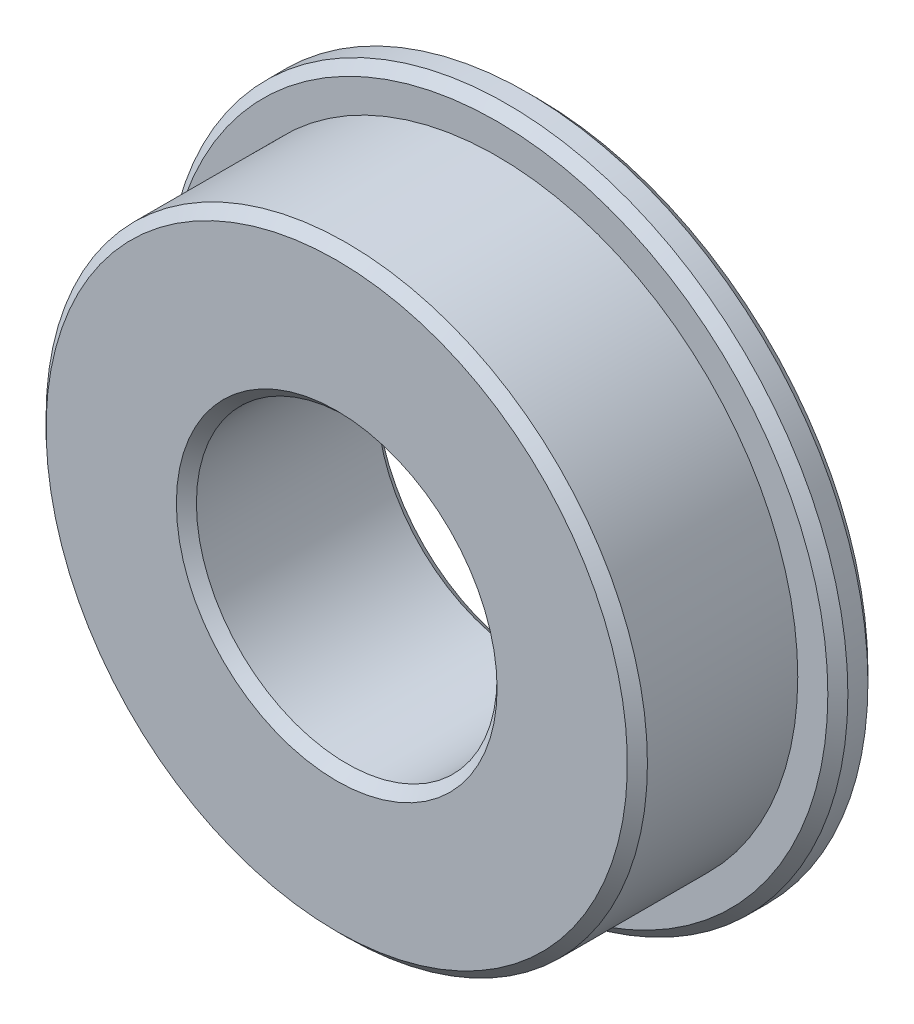
ISO-10303-21;
HEADER;
FILE_DESCRIPTION(('STEP AP214'),'2;1');
FILE_NAME('part.step','',(''),(''),'','','');
FILE_SCHEMA(('AUTOMOTIVE_DESIGN { 1 0 10303 214 1 1 1 1 }'));
ENDSEC;
DATA;
#1=APPLICATION_CONTEXT('core data for automotive mechanical design processes');
#2=APPLICATION_PROTOCOL_DEFINITION('international standard','automotive_design',2000,#1);
#3=PRODUCT_CONTEXT('',#1,'mechanical');
#4=PRODUCT('Part','Part','',(#3));
#5=PRODUCT_RELATED_PRODUCT_CATEGORY('part','',(#4));
#6=PRODUCT_DEFINITION_FORMATION('','',#4);
#7=PRODUCT_DEFINITION_CONTEXT('part definition',#1,'design');
#8=PRODUCT_DEFINITION('design','',#6,#7);
#9=PRODUCT_DEFINITION_SHAPE('','',#8);
#10=(LENGTH_UNIT() NAMED_UNIT(*) SI_UNIT(.MILLI.,.METRE.));
#11=(NAMED_UNIT(*) PLANE_ANGLE_UNIT() SI_UNIT($,.RADIAN.));
#12=(NAMED_UNIT(*) SI_UNIT($,.STERADIAN.) SOLID_ANGLE_UNIT());
#13=UNCERTAINTY_MEASURE_WITH_UNIT(LENGTH_MEASURE(1.E-05),#10,'distance_accuracy_value','');
#14=(GEOMETRIC_REPRESENTATION_CONTEXT(3) GLOBAL_UNCERTAINTY_ASSIGNED_CONTEXT((#13)) GLOBAL_UNIT_ASSIGNED_CONTEXT((#10,
#11,#12)) REPRESENTATION_CONTEXT('',''));
#15=CARTESIAN_POINT('',(0.,0.,0.));
#16=DIRECTION('',(0.,0.,1.));
#17=DIRECTION('',(1.,0.,0.));
#18=AXIS2_PLACEMENT_3D('',#15,#16,#17);
#19=CARTESIAN_POINT('',(0.,0.,-5.6843418860808E-11));
#20=DIRECTION('',(0.,0.,-1.));
#21=DIRECTION('',(-1.,0.,0.));
#22=AXIS2_PLACEMENT_3D('',#19,#20,#21);
#23=CONICAL_SURFACE('',#22,3.20000000004939,0.785398163397448);
#24=CARTESIAN_POINT('',(0.,0.,-5.6843418860808E-11));
#25=DIRECTION('',(0.,0.,-1.));
#26=DIRECTION('',(-1.,0.,0.));
#27=AXIS2_PLACEMENT_3D('',#24,#25,#26);
#28=CIRCLE('',#27,3.20000000004939);
#29=CARTESIAN_POINT('',(-3.20000000004939,0.,-5.6843418860808E-11));
#30=VERTEX_POINT('',#29);
#31=EDGE_CURVE('E18',#30,#30,#28,.T.);
#32=ORIENTED_EDGE('',*,*,#31,.T.);
#33=EDGE_LOOP('',(#32));
#34=FACE_BOUND('',#33,.T.);
#35=CARTESIAN_POINT('',(0.,0.,0.2));
#36=DIRECTION('',(0.,0.,1.));
#37=DIRECTION('',(1.,0.,0.));
#38=AXIS2_PLACEMENT_3D('',#35,#36,#37);
#39=CIRCLE('',#38,3.);
#40=CARTESIAN_POINT('',(3.,0.,0.2));
#41=VERTEX_POINT('',#40);
#42=EDGE_CURVE('E44',#41,#41,#39,.T.);
#43=ORIENTED_EDGE('',*,*,#42,.T.);
#44=EDGE_LOOP('',(#43));
#45=FACE_BOUND('',#44,.T.);
#46=ADVANCED_FACE('F15',(#34,#45),#23,.F.);
#47=CARTESIAN_POINT('',(0.,0.,0.));
#48=DIRECTION('',(0.,0.,1.));
#49=DIRECTION('',(1.,0.,0.));
#50=AXIS2_PLACEMENT_3D('',#47,#48,#49);
#51=PLANE('',#50);
#52=ORIENTED_EDGE('',*,*,#31,.F.);
#53=EDGE_LOOP('',(#52));
#54=FACE_BOUND('',#53,.T.);
#55=CARTESIAN_POINT('',(0.,0.,-1.1368686482667E-10));
#56=DIRECTION('',(0.,0.,1.));
#57=DIRECTION('',(0.,-1.,0.));
#58=AXIS2_PLACEMENT_3D('',#55,#56,#57);
#59=CIRCLE('',#58,6.59999999999172);
#60=CARTESIAN_POINT('',(0.,-6.59999999999172,-1.13686851672747E-10));
#61=VERTEX_POINT('',#60);
#62=EDGE_CURVE('E42',#61,#61,#59,.T.);
#63=ORIENTED_EDGE('',*,*,#62,.F.);
#64=EDGE_LOOP('',(#63));
#65=FACE_BOUND('',#64,.T.);
#66=ADVANCED_FACE('F73',(#54,#65),#51,.F.);
#67=CARTESIAN_POINT('',(0.,0.,0.));
#68=DIRECTION('',(0.,0.,1.));
#69=DIRECTION('',(1.,0.,0.));
#70=AXIS2_PLACEMENT_3D('',#67,#68,#69);
#71=CYLINDRICAL_SURFACE('',#70,3.);
#72=ORIENTED_EDGE('',*,*,#42,.F.);
#73=EDGE_LOOP('',(#72));
#74=FACE_BOUND('',#73,.T.);
#75=CARTESIAN_POINT('',(0.,0.,3.79999999995562));
#76=DIRECTION('',(0.,0.,1.));
#77=DIRECTION('',(1.,0.,0.));
#78=AXIS2_PLACEMENT_3D('',#75,#76,#77);
#79=CIRCLE('',#78,2.9999999999859);
#80=CARTESIAN_POINT('',(2.9999999999859,0.,3.79999999995562));
#81=VERTEX_POINT('',#80);
#82=EDGE_CURVE('E31',#81,#81,#79,.T.);
#83=ORIENTED_EDGE('',*,*,#82,.T.);
#84=EDGE_LOOP('',(#83));
#85=FACE_BOUND('',#84,.T.);
#86=ADVANCED_FACE('F64',(#74,#85),#71,.F.);
#87=CARTESIAN_POINT('',(0.,0.,0.199999999949796));
#88=DIRECTION('',(0.,0.,1.));
#89=DIRECTION('',(0.,-1.,0.));
#90=AXIS2_PLACEMENT_3D('',#87,#88,#89);
#91=CONICAL_SURFACE('',#90,6.80000000005521,0.785398163397448);
#92=ORIENTED_EDGE('',*,*,#62,.T.);
#93=EDGE_LOOP('',(#92));
#94=FACE_BOUND('',#93,.T.);
#95=CARTESIAN_POINT('',(0.,0.,0.2));
#96=DIRECTION('',(0.,0.,1.));
#97=DIRECTION('',(1.,0.,0.));
#98=AXIS2_PLACEMENT_3D('',#95,#96,#97);
#99=CIRCLE('',#98,6.8);
#100=CARTESIAN_POINT('',(6.8,0.,0.2));
#101=VERTEX_POINT('',#100);
#102=EDGE_CURVE('E41',#101,#101,#99,.T.);
#103=ORIENTED_EDGE('',*,*,#102,.F.);
#104=EDGE_LOOP('',(#103));
#105=FACE_BOUND('',#104,.T.);
#106=ADVANCED_FACE('F61',(#94,#105),#91,.T.);
#107=CARTESIAN_POINT('',(0.,0.,4.0000000000191));
#108=DIRECTION('',(0.,0.,1.));
#109=DIRECTION('',(1.,0.,0.));
#110=AXIS2_PLACEMENT_3D('',#107,#108,#109);
#111=CONICAL_SURFACE('',#110,3.20000000004939,0.785398163397448);
#112=ORIENTED_EDGE('',*,*,#82,.F.);
#113=EDGE_LOOP('',(#112));
#114=FACE_BOUND('',#113,.T.);
#115=CARTESIAN_POINT('',(0.,0.,4.0000000000191));
#116=DIRECTION('',(0.,0.,1.));
#117=DIRECTION('',(1.,0.,0.));
#118=AXIS2_PLACEMENT_3D('',#115,#116,#117);
#119=CIRCLE('',#118,3.20000000004939);
#120=CARTESIAN_POINT('',(3.20000000004939,0.,4.0000000000191));
#121=VERTEX_POINT('',#120);
#122=EDGE_CURVE('E39',#121,#121,#119,.F.);
#123=ORIENTED_EDGE('',*,*,#122,.F.);
#124=EDGE_LOOP('',(#123));
#125=FACE_BOUND('',#124,.T.);
#126=ADVANCED_FACE('F63',(#114,#125),#111,.F.);
#127=CARTESIAN_POINT('',(0.,0.,0.));
#128=DIRECTION('',(0.,0.,1.));
#129=DIRECTION('',(1.,0.,0.));
#130=AXIS2_PLACEMENT_3D('',#127,#128,#129);
#131=CYLINDRICAL_SURFACE('',#130,6.8);
#132=ORIENTED_EDGE('',*,*,#102,.T.);
#133=EDGE_LOOP('',(#132));
#134=FACE_BOUND('',#133,.T.);
#135=CARTESIAN_POINT('',(0.,0.,0.600000000019918));
#136=DIRECTION('',(0.,0.,-1.));
#137=DIRECTION('',(1.,0.,0.));
#138=AXIS2_PLACEMENT_3D('',#135,#136,#137);
#139=CIRCLE('',#138,6.80000000005521);
#140=CARTESIAN_POINT('',(6.80000000005521,0.,0.600000000019918));
#141=VERTEX_POINT('',#140);
#142=EDGE_CURVE('E38',#141,#141,#139,.F.);
#143=ORIENTED_EDGE('',*,*,#142,.F.);
#144=EDGE_LOOP('',(#143));
#145=FACE_BOUND('',#144,.T.);
#146=ADVANCED_FACE('F58',(#134,#145),#131,.T.);
#147=CARTESIAN_POINT('',(0.,0.,4.));
#148=DIRECTION('',(0.,0.,1.));
#149=DIRECTION('',(1.,0.,0.));
#150=AXIS2_PLACEMENT_3D('',#147,#148,#149);
#151=PLANE('',#150);
#152=ORIENTED_EDGE('',*,*,#122,.T.);
#153=EDGE_LOOP('',(#152));
#154=FACE_BOUND('',#153,.T.);
#155=CARTESIAN_POINT('',(0.,0.,4.0000000000191));
#156=DIRECTION('',(0.,0.,-1.));
#157=DIRECTION('',(0.,1.,0.));
#158=AXIS2_PLACEMENT_3D('',#155,#156,#157);
#159=CIRCLE('',#158,5.80000000002201);
#160=CARTESIAN_POINT('',(0.,5.80000000002201,4.0000000000191));
#161=VERTEX_POINT('',#160);
#162=EDGE_CURVE('E35',#161,#161,#159,.T.);
#163=ORIENTED_EDGE('',*,*,#162,.F.);
#164=EDGE_LOOP('',(#163));
#165=FACE_BOUND('',#164,.T.);
#166=ADVANCED_FACE('F94',(#154,#165),#151,.T.);
#167=CARTESIAN_POINT('',(0.,0.,0.600000000019918));
#168=DIRECTION('',(0.,0.,-1.));
#169=DIRECTION('',(-1.,0.,0.));
#170=AXIS2_PLACEMENT_3D('',#167,#168,#169);
#171=CONICAL_SURFACE('',#170,6.80000000005521,0.785398163397448);
#172=ORIENTED_EDGE('',*,*,#142,.T.);
#173=EDGE_LOOP('',(#172));
#174=FACE_BOUND('',#173,.T.);
#175=CARTESIAN_POINT('',(0.,0.,0.799999999969714));
#176=DIRECTION('',(0.,0.,-1.));
#177=DIRECTION('',(-1.,0.,0.));
#178=AXIS2_PLACEMENT_3D('',#175,#176,#177);
#179=CIRCLE('',#178,6.60000000010541);
#180=CARTESIAN_POINT('',(-6.60000000010541,0.,0.799999999969714));
#181=VERTEX_POINT('',#180);
#182=EDGE_CURVE('E27',#181,#181,#179,.F.);
#183=ORIENTED_EDGE('',*,*,#182,.F.);
#184=EDGE_LOOP('',(#183));
#185=FACE_BOUND('',#184,.T.);
#186=ADVANCED_FACE('F90',(#174,#185),#171,.T.);
#187=CARTESIAN_POINT('',(0.,0.,3.79999999989877));
#188=DIRECTION('',(0.,0.,-1.));
#189=DIRECTION('',(0.,1.,0.));
#190=AXIS2_PLACEMENT_3D('',#187,#188,#189);
#191=CONICAL_SURFACE('',#190,6.00000000014234,0.785398163397448);
#192=CARTESIAN_POINT('',(0.,0.,3.8));
#193=DIRECTION('',(0.,0.,1.));
#194=DIRECTION('',(1.,0.,0.));
#195=AXIS2_PLACEMENT_3D('',#192,#193,#194);
#196=CIRCLE('',#195,6.);
#197=CARTESIAN_POINT('',(6.,0.,3.8));
#198=VERTEX_POINT('',#197);
#199=EDGE_CURVE('E22',#198,#198,#196,.F.);
#200=ORIENTED_EDGE('',*,*,#199,.F.);
#201=EDGE_LOOP('',(#200));
#202=FACE_BOUND('',#201,.T.);
#203=ORIENTED_EDGE('',*,*,#162,.T.);
#204=EDGE_LOOP('',(#203));
#205=FACE_BOUND('',#204,.T.);
#206=ADVANCED_FACE('F83',(#202,#205),#191,.T.);
#207=CARTESIAN_POINT('',(0.,0.,0.8));
#208=DIRECTION('',(0.,0.,1.));
#209=DIRECTION('',(1.,0.,0.));
#210=AXIS2_PLACEMENT_3D('',#207,#208,#209);
#211=PLANE('',#210);
#212=CARTESIAN_POINT('',(0.,0.,0.8));
#213=DIRECTION('',(0.,0.,1.));
#214=DIRECTION('',(1.,0.,0.));
#215=AXIS2_PLACEMENT_3D('',#212,#213,#214);
#216=CIRCLE('',#215,6.);
#217=CARTESIAN_POINT('',(6.,0.,0.8));
#218=VERTEX_POINT('',#217);
#219=EDGE_CURVE('E10',#218,#218,#216,.T.);
#220=ORIENTED_EDGE('',*,*,#219,.F.);
#221=EDGE_LOOP('',(#220));
#222=FACE_BOUND('',#221,.T.);
#223=ORIENTED_EDGE('',*,*,#182,.T.);
#224=EDGE_LOOP('',(#223));
#225=FACE_BOUND('',#224,.T.);
#226=ADVANCED_FACE('F78',(#222,#225),#211,.T.);
#227=CARTESIAN_POINT('',(0.,0.,0.));
#228=DIRECTION('',(0.,0.,1.));
#229=DIRECTION('',(1.,0.,0.));
#230=AXIS2_PLACEMENT_3D('',#227,#228,#229);
#231=CYLINDRICAL_SURFACE('',#230,6.);
#232=ORIENTED_EDGE('',*,*,#219,.T.);
#233=EDGE_LOOP('',(#232));
#234=FACE_BOUND('',#233,.T.);
#235=ORIENTED_EDGE('',*,*,#199,.T.);
#236=EDGE_LOOP('',(#235));
#237=FACE_BOUND('',#236,.T.);
#238=ADVANCED_FACE('F76',(#234,#237),#231,.T.);
#239=CLOSED_SHELL('',(#46,#66,#86,#106,#126,#146,#166,#186,#206,#226,#238));
#240=MANIFOLD_SOLID_BREP('B1',#239);
#241=ADVANCED_BREP_SHAPE_REPRESENTATION('',(#18,#240),#14);
#242=SHAPE_DEFINITION_REPRESENTATION(#9,#241);
ENDSEC;
END-ISO-10303-21;
